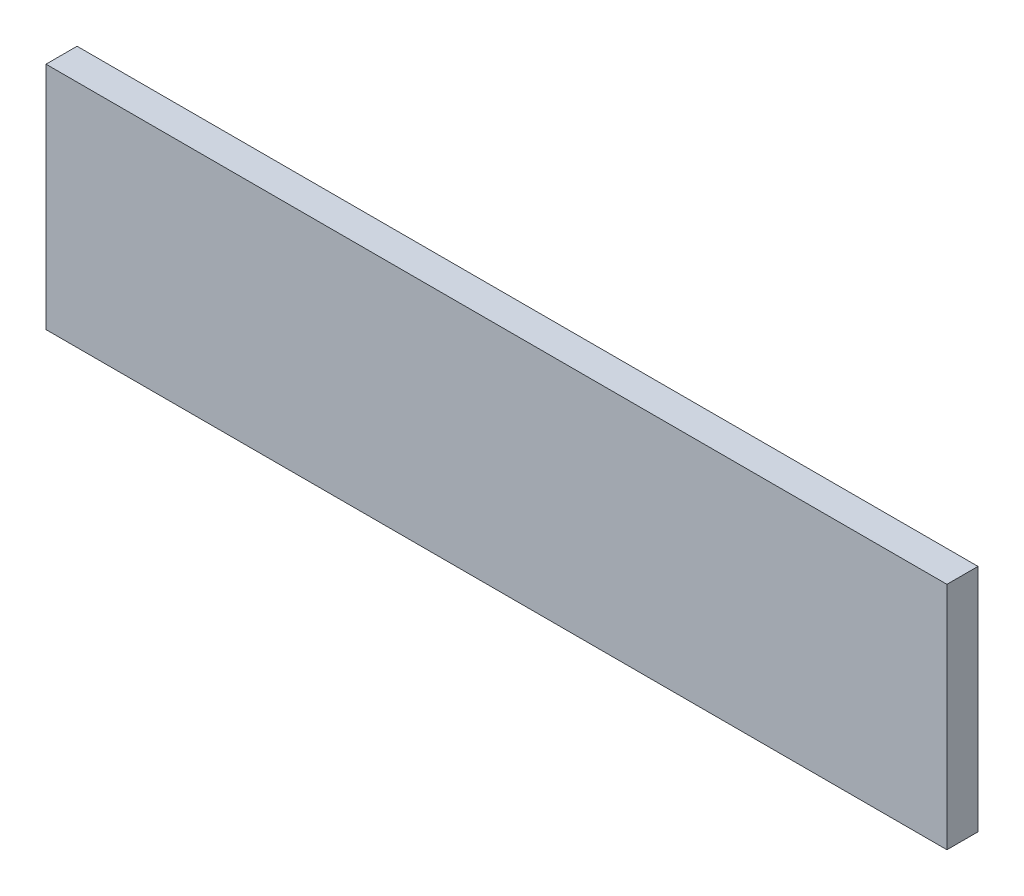
ISO-10303-21;
HEADER;
FILE_DESCRIPTION(('STEP AP214'),'2;1');
FILE_NAME('part.step','',(''),(''),'','','');
FILE_SCHEMA(('AUTOMOTIVE_DESIGN { 1 0 10303 214 1 1 1 1 }'));
ENDSEC;
DATA;
#1=APPLICATION_CONTEXT('core data for automotive mechanical design processes');
#2=APPLICATION_PROTOCOL_DEFINITION('international standard','automotive_design',2000,#1);
#3=PRODUCT_CONTEXT('',#1,'mechanical');
#4=PRODUCT('Part','Part','',(#3));
#5=PRODUCT_RELATED_PRODUCT_CATEGORY('part','',(#4));
#6=PRODUCT_DEFINITION_FORMATION('','',#4);
#7=PRODUCT_DEFINITION_CONTEXT('part definition',#1,'design');
#8=PRODUCT_DEFINITION('design','',#6,#7);
#9=PRODUCT_DEFINITION_SHAPE('','',#8);
#10=(LENGTH_UNIT() NAMED_UNIT(*) SI_UNIT(.MILLI.,.METRE.));
#11=(NAMED_UNIT(*) PLANE_ANGLE_UNIT() SI_UNIT($,.RADIAN.));
#12=(NAMED_UNIT(*) SI_UNIT($,.STERADIAN.) SOLID_ANGLE_UNIT());
#13=UNCERTAINTY_MEASURE_WITH_UNIT(LENGTH_MEASURE(1.E-05),#10,'distance_accuracy_value','');
#14=(GEOMETRIC_REPRESENTATION_CONTEXT(3) GLOBAL_UNCERTAINTY_ASSIGNED_CONTEXT((#13)) GLOBAL_UNIT_ASSIGNED_CONTEXT((#10,
#11,#12)) REPRESENTATION_CONTEXT('',''));
#15=CARTESIAN_POINT('',(0.,0.,0.));
#16=DIRECTION('',(0.,0.,1.));
#17=DIRECTION('',(1.,0.,0.));
#18=AXIS2_PLACEMENT_3D('',#15,#16,#17);
#19=CARTESIAN_POINT('',(-90.,67.,10.));
#20=DIRECTION('',(1.,0.,0.));
#21=DIRECTION('',(0.,1.,0.));
#22=AXIS2_PLACEMENT_3D('',#19,#20,#21);
#23=PLANE('',#22);
#24=DIRECTION('',(0.,-1.,0.));
#25=VECTOR('',#24,1.);
#26=CARTESIAN_POINT('',(-90.,67.,0.));
#27=LINE('',#26,#25);
#28=CARTESIAN_POINT('',(-90.,67.,0.));
#29=VERTEX_POINT('',#28);
#30=CARTESIAN_POINT('',(-90.,-6.99999999999999,0.));
#31=VERTEX_POINT('',#30);
#32=EDGE_CURVE('E96',#29,#31,#27,.T.);
#33=ORIENTED_EDGE('',*,*,#32,.T.);
#34=DIRECTION('',(0.,0.,-1.));
#35=VECTOR('',#34,1.);
#36=CARTESIAN_POINT('',(-90.,-6.99999999999999,10.));
#37=LINE('',#36,#35);
#38=CARTESIAN_POINT('',(-90.,-6.99999999999999,10.));
#39=VERTEX_POINT('',#38);
#40=EDGE_CURVE('E11',#39,#31,#37,.T.);
#41=ORIENTED_EDGE('',*,*,#40,.F.);
#42=DIRECTION('',(0.,-1.,0.));
#43=VECTOR('',#42,1.);
#44=CARTESIAN_POINT('',(-90.,67.,10.));
#45=LINE('',#44,#43);
#46=CARTESIAN_POINT('',(-90.,67.,10.));
#47=VERTEX_POINT('',#46);
#48=EDGE_CURVE('E84',#47,#39,#45,.T.);
#49=ORIENTED_EDGE('',*,*,#48,.F.);
#50=DIRECTION('',(0.,0.,-1.));
#51=VECTOR('',#50,1.);
#52=CARTESIAN_POINT('',(-90.,67.,10.));
#53=LINE('',#52,#51);
#54=EDGE_CURVE('E92',#47,#29,#53,.T.);
#55=ORIENTED_EDGE('',*,*,#54,.T.);
#56=EDGE_LOOP('',(#33,#41,#49,#55));
#57=FACE_BOUND('',#56,.T.);
#58=ADVANCED_FACE('F33',(#57),#23,.F.);
#59=CARTESIAN_POINT('',(-90.,-6.99999999999999,10.));
#60=DIRECTION('',(0.,1.,0.));
#61=DIRECTION('',(0.,0.,1.));
#62=AXIS2_PLACEMENT_3D('',#59,#60,#61);
#63=PLANE('',#62);
#64=DIRECTION('',(1.,0.,0.));
#65=VECTOR('',#64,1.);
#66=CARTESIAN_POINT('',(-90.,-6.99999999999999,0.));
#67=LINE('',#66,#65);
#68=CARTESIAN_POINT('',(200.,-6.99999999999999,0.));
#69=VERTEX_POINT('',#68);
#70=EDGE_CURVE('E88',#31,#69,#67,.T.);
#71=ORIENTED_EDGE('',*,*,#70,.T.);
#72=DIRECTION('',(0.,0.,-1.));
#73=VECTOR('',#72,1.);
#74=CARTESIAN_POINT('',(200.,-6.99999999999999,10.));
#75=LINE('',#74,#73);
#76=CARTESIAN_POINT('',(200.,-6.99999999999999,10.));
#77=VERTEX_POINT('',#76);
#78=EDGE_CURVE('E41',#77,#69,#75,.T.);
#79=ORIENTED_EDGE('',*,*,#78,.F.);
#80=DIRECTION('',(1.,0.,0.));
#81=VECTOR('',#80,1.);
#82=CARTESIAN_POINT('',(-90.,-6.99999999999999,10.));
#83=LINE('',#82,#81);
#84=EDGE_CURVE('E79',#39,#77,#83,.T.);
#85=ORIENTED_EDGE('',*,*,#84,.F.);
#86=ORIENTED_EDGE('',*,*,#40,.T.);
#87=EDGE_LOOP('',(#71,#79,#85,#86));
#88=FACE_BOUND('',#87,.T.);
#89=ADVANCED_FACE('F87',(#88),#63,.F.);
#90=CARTESIAN_POINT('',(200.,67.,10.));
#91=DIRECTION('',(-1.,0.,0.));
#92=DIRECTION('',(0.,-1.,0.));
#93=AXIS2_PLACEMENT_3D('',#90,#91,#92);
#94=PLANE('',#93);
#95=DIRECTION('',(0.,1.,0.));
#96=VECTOR('',#95,1.);
#97=CARTESIAN_POINT('',(200.,67.,0.));
#98=LINE('',#97,#96);
#99=CARTESIAN_POINT('',(200.,67.,0.));
#100=VERTEX_POINT('',#99);
#101=EDGE_CURVE('E66',#69,#100,#98,.T.);
#102=ORIENTED_EDGE('',*,*,#101,.T.);
#103=DIRECTION('',(0.,0.,-1.));
#104=VECTOR('',#103,1.);
#105=CARTESIAN_POINT('',(200.,67.,10.));
#106=LINE('',#105,#104);
#107=CARTESIAN_POINT('',(200.,67.,10.));
#108=VERTEX_POINT('',#107);
#109=EDGE_CURVE('E89',#108,#100,#106,.T.);
#110=ORIENTED_EDGE('',*,*,#109,.F.);
#111=DIRECTION('',(0.,1.,0.));
#112=VECTOR('',#111,1.);
#113=CARTESIAN_POINT('',(200.,67.,10.));
#114=LINE('',#113,#112);
#115=EDGE_CURVE('E82',#77,#108,#114,.T.);
#116=ORIENTED_EDGE('',*,*,#115,.F.);
#117=ORIENTED_EDGE('',*,*,#78,.T.);
#118=EDGE_LOOP('',(#102,#110,#116,#117));
#119=FACE_BOUND('',#118,.T.);
#120=ADVANCED_FACE('F90',(#119),#94,.F.);
#121=CARTESIAN_POINT('',(-90.,67.,10.));
#122=DIRECTION('',(0.,-1.,0.));
#123=DIRECTION('',(0.,0.,-1.));
#124=AXIS2_PLACEMENT_3D('',#121,#122,#123);
#125=PLANE('',#124);
#126=DIRECTION('',(-1.,0.,0.));
#127=VECTOR('',#126,1.);
#128=CARTESIAN_POINT('',(-90.,67.,0.));
#129=LINE('',#128,#127);
#130=EDGE_CURVE('E72',#100,#29,#129,.T.);
#131=ORIENTED_EDGE('',*,*,#130,.T.);
#132=ORIENTED_EDGE('',*,*,#54,.F.);
#133=DIRECTION('',(-1.,0.,0.));
#134=VECTOR('',#133,1.);
#135=CARTESIAN_POINT('',(-90.,67.,10.));
#136=LINE('',#135,#134);
#137=EDGE_CURVE('E49',#108,#47,#136,.T.);
#138=ORIENTED_EDGE('',*,*,#137,.F.);
#139=ORIENTED_EDGE('',*,*,#109,.T.);
#140=EDGE_LOOP('',(#131,#132,#138,#139));
#141=FACE_BOUND('',#140,.T.);
#142=ADVANCED_FACE('F103',(#141),#125,.F.);
#143=CARTESIAN_POINT('',(0.,0.,10.));
#144=DIRECTION('',(0.,0.,1.));
#145=DIRECTION('',(1.,0.,0.));
#146=AXIS2_PLACEMENT_3D('',#143,#144,#145);
#147=PLANE('',#146);
#148=ORIENTED_EDGE('',*,*,#48,.T.);
#149=ORIENTED_EDGE('',*,*,#84,.T.);
#150=ORIENTED_EDGE('',*,*,#115,.T.);
#151=ORIENTED_EDGE('',*,*,#137,.T.);
#152=EDGE_LOOP('',(#148,#149,#150,#151));
#153=FACE_BOUND('',#152,.T.);
#154=ADVANCED_FACE('F80',(#153),#147,.T.);
#155=CARTESIAN_POINT('',(0.,0.,0.));
#156=DIRECTION('',(0.,0.,1.));
#157=DIRECTION('',(1.,0.,0.));
#158=AXIS2_PLACEMENT_3D('',#155,#156,#157);
#159=PLANE('',#158);
#160=ORIENTED_EDGE('',*,*,#32,.F.);
#161=ORIENTED_EDGE('',*,*,#130,.F.);
#162=ORIENTED_EDGE('',*,*,#101,.F.);
#163=ORIENTED_EDGE('',*,*,#70,.F.);
#164=EDGE_LOOP('',(#160,#161,#162,#163));
#165=FACE_BOUND('',#164,.T.);
#166=ADVANCED_FACE('F106',(#165),#159,.F.);
#167=CLOSED_SHELL('',(#58,#89,#120,#142,#154,#166));
#168=MANIFOLD_SOLID_BREP('B2',#167);
#169=ADVANCED_BREP_SHAPE_REPRESENTATION('',(#18,#168),#14);
#170=SHAPE_DEFINITION_REPRESENTATION(#9,#169);
ENDSEC;
END-ISO-10303-21;
